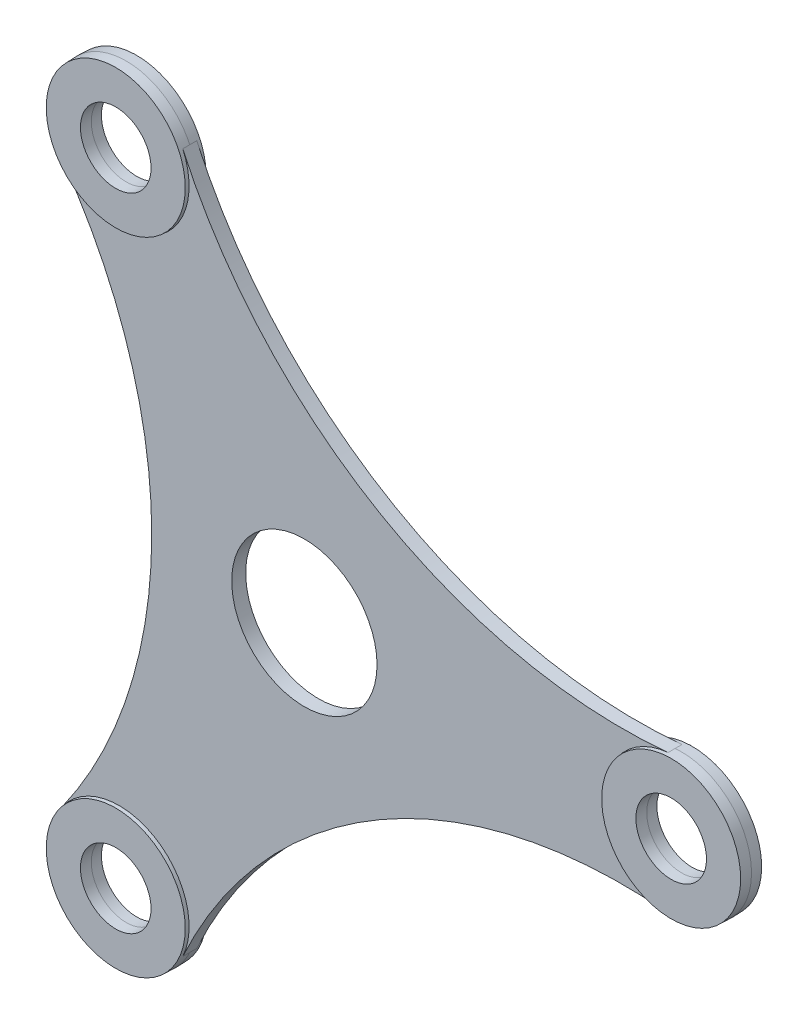
ISO-10303-21;
HEADER;
FILE_DESCRIPTION(('STEP AP214'),'2;1');
FILE_NAME('part.step','',(''),(''),'','','');
FILE_SCHEMA(('AUTOMOTIVE_DESIGN { 1 0 10303 214 1 1 1 1 }'));
ENDSEC;
DATA;
#1=APPLICATION_CONTEXT('core data for automotive mechanical design processes');
#2=APPLICATION_PROTOCOL_DEFINITION('international standard','automotive_design',2000,#1);
#3=PRODUCT_CONTEXT('',#1,'mechanical');
#4=PRODUCT('Part','Part','',(#3));
#5=PRODUCT_RELATED_PRODUCT_CATEGORY('part','',(#4));
#6=PRODUCT_DEFINITION_FORMATION('','',#4);
#7=PRODUCT_DEFINITION_CONTEXT('part definition',#1,'design');
#8=PRODUCT_DEFINITION('design','',#6,#7);
#9=PRODUCT_DEFINITION_SHAPE('','',#8);
#10=(LENGTH_UNIT() NAMED_UNIT(*) SI_UNIT(.MILLI.,.METRE.));
#11=(NAMED_UNIT(*) PLANE_ANGLE_UNIT() SI_UNIT($,.RADIAN.));
#12=(NAMED_UNIT(*) SI_UNIT($,.STERADIAN.) SOLID_ANGLE_UNIT());
#13=UNCERTAINTY_MEASURE_WITH_UNIT(LENGTH_MEASURE(1.E-05),#10,'distance_accuracy_value','');
#14=(GEOMETRIC_REPRESENTATION_CONTEXT(3) GLOBAL_UNCERTAINTY_ASSIGNED_CONTEXT((#13)) GLOBAL_UNIT_ASSIGNED_CONTEXT((#10,
#11,#12)) REPRESENTATION_CONTEXT('',''));
#15=CARTESIAN_POINT('',(0.,0.,0.));
#16=DIRECTION('',(0.,0.,1.));
#17=DIRECTION('',(1.,0.,0.));
#18=AXIS2_PLACEMENT_3D('',#15,#16,#17);
#19=CARTESIAN_POINT('',(264.973105174423,0.,0.));
#20=DIRECTION('',(0.,0.,-1.));
#21=DIRECTION('',(1.,0.,0.));
#22=AXIS2_PLACEMENT_3D('',#19,#20,#21);
#23=CONICAL_SURFACE('',#22,25.,0.0349065850398867);
#24=CARTESIAN_POINT('',(264.973105174423,0.,-7.5));
#25=DIRECTION('',(0.,0.,1.));
#26=DIRECTION('',(1.,0.,0.));
#27=AXIS2_PLACEMENT_3D('',#24,#25,#26);
#28=CIRCLE('',#27,25.2619057711881);
#29=CARTESIAN_POINT('',(290.235010945611,0.,-7.5));
#30=VERTEX_POINT('',#29);
#31=EDGE_CURVE('E61',#30,#30,#28,.T.);
#32=ORIENTED_EDGE('',*,*,#31,.F.);
#33=EDGE_LOOP('',(#32));
#34=FACE_BOUND('',#33,.T.);
#35=CARTESIAN_POINT('',(264.973105174423,0.,0.));
#36=DIRECTION('',(0.,0.,1.));
#37=DIRECTION('',(1.,0.,0.));
#38=AXIS2_PLACEMENT_3D('',#35,#36,#37);
#39=CIRCLE('',#38,25.);
#40=CARTESIAN_POINT('',(289.973105174423,0.,0.));
#41=VERTEX_POINT('',#40);
#42=EDGE_CURVE('E77',#41,#41,#39,.T.);
#43=ORIENTED_EDGE('',*,*,#42,.T.);
#44=EDGE_LOOP('',(#43));
#45=FACE_BOUND('',#44,.T.);
#46=ADVANCED_FACE('F54',(#34,#45),#23,.F.);
#47=CARTESIAN_POINT('',(264.973105174423,0.,0.));
#48=DIRECTION('',(0.,0.,1.));
#49=DIRECTION('',(1.,0.,0.));
#50=AXIS2_PLACEMENT_3D('',#47,#48,#49);
#51=CONICAL_SURFACE('',#50,50.0000000000001,0.0349065850398867);
#52=CARTESIAN_POINT('',(264.973105174423,0.,-7.5));
#53=DIRECTION('',(0.,0.,1.));
#54=DIRECTION('',(1.,0.,0.));
#55=AXIS2_PLACEMENT_3D('',#52,#53,#54);
#56=CIRCLE('',#55,49.738094228812);
#57=CARTESIAN_POINT('',(314.711199403235,0.,-7.5));
#58=VERTEX_POINT('',#57);
#59=EDGE_CURVE('E11',#58,#58,#56,.T.);
#60=ORIENTED_EDGE('',*,*,#59,.T.);
#61=EDGE_LOOP('',(#60));
#62=FACE_BOUND('',#61,.T.);
#63=CARTESIAN_POINT('',(264.973105174423,0.,0.));
#64=DIRECTION('',(0.,0.,1.));
#65=DIRECTION('',(1.,0.,0.));
#66=AXIS2_PLACEMENT_3D('',#63,#64,#65);
#67=CIRCLE('',#66,50.0000000000001);
#68=CARTESIAN_POINT('',(314.973105174423,0.,0.));
#69=VERTEX_POINT('',#68);
#70=EDGE_CURVE('E65',#69,#69,#67,.T.);
#71=ORIENTED_EDGE('',*,*,#70,.F.);
#72=EDGE_LOOP('',(#71));
#73=FACE_BOUND('',#72,.T.);
#74=ADVANCED_FACE('F56',(#62,#73),#51,.T.);
#75=CARTESIAN_POINT('',(0.,0.,-7.5));
#76=DIRECTION('',(0.,0.,1.));
#77=DIRECTION('',(1.,0.,0.));
#78=AXIS2_PLACEMENT_3D('',#75,#76,#77);
#79=PLANE('',#78);
#80=ORIENTED_EDGE('',*,*,#31,.T.);
#81=EDGE_LOOP('',(#80));
#82=FACE_BOUND('',#81,.T.);
#83=ORIENTED_EDGE('',*,*,#59,.F.);
#84=EDGE_LOOP('',(#83));
#85=FACE_BOUND('',#84,.T.);
#86=ADVANCED_FACE('F85',(#82,#85),#79,.F.);
#87=CARTESIAN_POINT('',(264.973105174423,0.,0.));
#88=DIRECTION('',(0.,0.,1.));
#89=DIRECTION('',(1.,0.,0.));
#90=AXIS2_PLACEMENT_3D('',#87,#88,#89);
#91=CONICAL_SURFACE('',#90,25.,0.0349065850398867);
#92=CARTESIAN_POINT('',(264.973105174423,0.,7.5));
#93=DIRECTION('',(0.,0.,1.));
#94=DIRECTION('',(1.,0.,0.));
#95=AXIS2_PLACEMENT_3D('',#92,#93,#94);
#96=CIRCLE('',#95,25.2619057711881);
#97=CARTESIAN_POINT('',(290.235010945611,0.,7.5));
#98=VERTEX_POINT('',#97);
#99=EDGE_CURVE('E74',#98,#98,#96,.T.);
#100=ORIENTED_EDGE('',*,*,#99,.T.);
#101=EDGE_LOOP('',(#100));
#102=FACE_BOUND('',#101,.T.);
#103=ORIENTED_EDGE('',*,*,#42,.F.);
#104=EDGE_LOOP('',(#103));
#105=FACE_BOUND('',#104,.T.);
#106=ADVANCED_FACE('F82',(#102,#105),#91,.F.);
#107=CARTESIAN_POINT('',(264.973105174423,0.,0.));
#108=DIRECTION('',(0.,0.,-1.));
#109=DIRECTION('',(1.,0.,0.));
#110=AXIS2_PLACEMENT_3D('',#107,#108,#109);
#111=CONICAL_SURFACE('',#110,50.0000000000001,0.0349065850398867);
#112=CARTESIAN_POINT('',(264.973105174423,0.,7.5));
#113=DIRECTION('',(0.,0.,1.));
#114=DIRECTION('',(1.,0.,0.));
#115=AXIS2_PLACEMENT_3D('',#112,#113,#114);
#116=CIRCLE('',#115,49.738094228812);
#117=CARTESIAN_POINT('',(314.711199403235,0.,7.5));
#118=VERTEX_POINT('',#117);
#119=EDGE_CURVE('E69',#118,#118,#116,.T.);
#120=ORIENTED_EDGE('',*,*,#119,.F.);
#121=EDGE_LOOP('',(#120));
#122=FACE_BOUND('',#121,.T.);
#123=ORIENTED_EDGE('',*,*,#70,.T.);
#124=EDGE_LOOP('',(#123));
#125=FACE_BOUND('',#124,.T.);
#126=ADVANCED_FACE('F84',(#122,#125),#111,.T.);
#127=CARTESIAN_POINT('',(0.,0.,7.5));
#128=DIRECTION('',(0.,0.,1.));
#129=DIRECTION('',(1.,0.,0.));
#130=AXIS2_PLACEMENT_3D('',#127,#128,#129);
#131=PLANE('',#130);
#132=ORIENTED_EDGE('',*,*,#99,.F.);
#133=EDGE_LOOP('',(#132));
#134=FACE_BOUND('',#133,.T.);
#135=ORIENTED_EDGE('',*,*,#119,.T.);
#136=EDGE_LOOP('',(#135));
#137=FACE_BOUND('',#136,.T.);
#138=ADVANCED_FACE('F92',(#134,#137),#131,.T.);
#139=CLOSED_SHELL('',(#46,#74,#86,#106,#126,#138));
#140=MANIFOLD_SOLID_BREP('B2',#139);
#141=CARTESIAN_POINT('',(-132.486552587212,-229.473440400696,0.));
#142=DIRECTION('',(0.,0.,-1.));
#143=DIRECTION('',(1.,0.,0.));
#144=AXIS2_PLACEMENT_3D('',#141,#142,#143);
#145=CONICAL_SURFACE('',#144,25.,0.0349065850398867);
#146=CARTESIAN_POINT('',(-132.486552587212,-229.473440400696,-7.5));
#147=DIRECTION('',(0.,0.,1.));
#148=DIRECTION('',(1.,0.,0.));
#149=AXIS2_PLACEMENT_3D('',#146,#147,#148);
#150=CIRCLE('',#149,25.2619057711881);
#151=CARTESIAN_POINT('',(-107.224646816023,-229.473440400696,-7.5));
#152=VERTEX_POINT('',#151);
#153=EDGE_CURVE('E161',#152,#152,#150,.T.);
#154=ORIENTED_EDGE('',*,*,#153,.F.);
#155=EDGE_LOOP('',(#154));
#156=FACE_BOUND('',#155,.T.);
#157=CARTESIAN_POINT('',(-132.486552587212,-229.473440400696,0.));
#158=DIRECTION('',(0.,0.,1.));
#159=DIRECTION('',(1.,0.,0.));
#160=AXIS2_PLACEMENT_3D('',#157,#158,#159);
#161=CIRCLE('',#160,25.);
#162=CARTESIAN_POINT('',(-107.486552587212,-229.473440400696,0.));
#163=VERTEX_POINT('',#162);
#164=EDGE_CURVE('E177',#163,#163,#161,.T.);
#165=ORIENTED_EDGE('',*,*,#164,.T.);
#166=EDGE_LOOP('',(#165));
#167=FACE_BOUND('',#166,.T.);
#168=ADVANCED_FACE('F154',(#156,#167),#145,.F.);
#169=CARTESIAN_POINT('',(-132.486552587212,-229.473440400696,0.));
#170=DIRECTION('',(0.,0.,1.));
#171=DIRECTION('',(1.,0.,0.));
#172=AXIS2_PLACEMENT_3D('',#169,#170,#171);
#173=CONICAL_SURFACE('',#172,50.,0.0349065850398867);
#174=CARTESIAN_POINT('',(-132.486552587212,-229.473440400696,-7.5));
#175=DIRECTION('',(0.,0.,1.));
#176=DIRECTION('',(1.,0.,0.));
#177=AXIS2_PLACEMENT_3D('',#174,#175,#176);
#178=CIRCLE('',#177,49.7380942288119);
#179=CARTESIAN_POINT('',(-82.7484583583997,-229.473440400696,-7.5));
#180=VERTEX_POINT('',#179);
#181=EDGE_CURVE('E53',#180,#180,#178,.T.);
#182=ORIENTED_EDGE('',*,*,#181,.T.);
#183=EDGE_LOOP('',(#182));
#184=FACE_BOUND('',#183,.T.);
#185=CARTESIAN_POINT('',(-132.486552587212,-229.473440400696,0.));
#186=DIRECTION('',(0.,0.,1.));
#187=DIRECTION('',(1.,0.,0.));
#188=AXIS2_PLACEMENT_3D('',#185,#186,#187);
#189=CIRCLE('',#188,50.);
#190=CARTESIAN_POINT('',(-82.4865525872115,-229.473440400696,0.));
#191=VERTEX_POINT('',#190);
#192=EDGE_CURVE('E165',#191,#191,#189,.T.);
#193=ORIENTED_EDGE('',*,*,#192,.F.);
#194=EDGE_LOOP('',(#193));
#195=FACE_BOUND('',#194,.T.);
#196=ADVANCED_FACE('F156',(#184,#195),#173,.T.);
#197=CARTESIAN_POINT('',(0.,0.,-7.5));
#198=DIRECTION('',(0.,0.,1.));
#199=DIRECTION('',(1.,0.,0.));
#200=AXIS2_PLACEMENT_3D('',#197,#198,#199);
#201=PLANE('',#200);
#202=ORIENTED_EDGE('',*,*,#153,.T.);
#203=EDGE_LOOP('',(#202));
#204=FACE_BOUND('',#203,.T.);
#205=ORIENTED_EDGE('',*,*,#181,.F.);
#206=EDGE_LOOP('',(#205));
#207=FACE_BOUND('',#206,.T.);
#208=ADVANCED_FACE('F185',(#204,#207),#201,.F.);
#209=CARTESIAN_POINT('',(-132.486552587212,-229.473440400696,0.));
#210=DIRECTION('',(0.,0.,1.));
#211=DIRECTION('',(1.,0.,0.));
#212=AXIS2_PLACEMENT_3D('',#209,#210,#211);
#213=CONICAL_SURFACE('',#212,25.,0.0349065850398867);
#214=CARTESIAN_POINT('',(-132.486552587212,-229.473440400696,7.5));
#215=DIRECTION('',(0.,0.,1.));
#216=DIRECTION('',(1.,0.,0.));
#217=AXIS2_PLACEMENT_3D('',#214,#215,#216);
#218=CIRCLE('',#217,25.2619057711881);
#219=CARTESIAN_POINT('',(-107.224646816023,-229.473440400696,7.5));
#220=VERTEX_POINT('',#219);
#221=EDGE_CURVE('E174',#220,#220,#218,.T.);
#222=ORIENTED_EDGE('',*,*,#221,.T.);
#223=EDGE_LOOP('',(#222));
#224=FACE_BOUND('',#223,.T.);
#225=ORIENTED_EDGE('',*,*,#164,.F.);
#226=EDGE_LOOP('',(#225));
#227=FACE_BOUND('',#226,.T.);
#228=ADVANCED_FACE('F182',(#224,#227),#213,.F.);
#229=CARTESIAN_POINT('',(-132.486552587212,-229.473440400696,0.));
#230=DIRECTION('',(0.,0.,-1.));
#231=DIRECTION('',(1.,0.,0.));
#232=AXIS2_PLACEMENT_3D('',#229,#230,#231);
#233=CONICAL_SURFACE('',#232,50.,0.0349065850398867);
#234=CARTESIAN_POINT('',(-132.486552587212,-229.473440400696,7.5));
#235=DIRECTION('',(0.,0.,1.));
#236=DIRECTION('',(1.,0.,0.));
#237=AXIS2_PLACEMENT_3D('',#234,#235,#236);
#238=CIRCLE('',#237,49.7380942288119);
#239=CARTESIAN_POINT('',(-82.7484583583997,-229.473440400696,7.5));
#240=VERTEX_POINT('',#239);
#241=EDGE_CURVE('E169',#240,#240,#238,.T.);
#242=ORIENTED_EDGE('',*,*,#241,.F.);
#243=EDGE_LOOP('',(#242));
#244=FACE_BOUND('',#243,.T.);
#245=ORIENTED_EDGE('',*,*,#192,.T.);
#246=EDGE_LOOP('',(#245));
#247=FACE_BOUND('',#246,.T.);
#248=ADVANCED_FACE('F184',(#244,#247),#233,.T.);
#249=CARTESIAN_POINT('',(0.,0.,7.5));
#250=DIRECTION('',(0.,0.,1.));
#251=DIRECTION('',(1.,0.,0.));
#252=AXIS2_PLACEMENT_3D('',#249,#250,#251);
#253=PLANE('',#252);
#254=ORIENTED_EDGE('',*,*,#221,.F.);
#255=EDGE_LOOP('',(#254));
#256=FACE_BOUND('',#255,.T.);
#257=ORIENTED_EDGE('',*,*,#241,.T.);
#258=EDGE_LOOP('',(#257));
#259=FACE_BOUND('',#258,.T.);
#260=ADVANCED_FACE('F192',(#256,#259),#253,.T.);
#261=CLOSED_SHELL('',(#168,#196,#208,#228,#248,#260));
#262=MANIFOLD_SOLID_BREP('B6',#261);
#263=CARTESIAN_POINT('',(-132.486552587211,229.473440400696,0.));
#264=DIRECTION('',(0.,0.,-1.));
#265=DIRECTION('',(1.,0.,0.));
#266=AXIS2_PLACEMENT_3D('',#263,#264,#265);
#267=CONICAL_SURFACE('',#266,25.,0.0349065850398867);
#268=CARTESIAN_POINT('',(-132.486552587211,229.473440400696,-7.5));
#269=DIRECTION('',(0.,0.,1.));
#270=DIRECTION('',(1.,0.,0.));
#271=AXIS2_PLACEMENT_3D('',#268,#269,#270);
#272=CIRCLE('',#271,25.2619057711881);
#273=CARTESIAN_POINT('',(-107.224646816023,229.473440400696,-7.5));
#274=VERTEX_POINT('',#273);
#275=EDGE_CURVE('E262',#274,#274,#272,.T.);
#276=ORIENTED_EDGE('',*,*,#275,.F.);
#277=EDGE_LOOP('',(#276));
#278=FACE_BOUND('',#277,.T.);
#279=CARTESIAN_POINT('',(-132.486552587211,229.473440400696,0.));
#280=DIRECTION('',(0.,0.,1.));
#281=DIRECTION('',(1.,0.,0.));
#282=AXIS2_PLACEMENT_3D('',#279,#280,#281);
#283=CIRCLE('',#282,25.);
#284=CARTESIAN_POINT('',(-107.486552587211,229.473440400696,0.));
#285=VERTEX_POINT('',#284);
#286=EDGE_CURVE('E278',#285,#285,#283,.T.);
#287=ORIENTED_EDGE('',*,*,#286,.T.);
#288=EDGE_LOOP('',(#287));
#289=FACE_BOUND('',#288,.T.);
#290=ADVANCED_FACE('F255',(#278,#289),#267,.F.);
#291=CARTESIAN_POINT('',(-132.486552587211,229.473440400696,0.));
#292=DIRECTION('',(0.,0.,1.));
#293=DIRECTION('',(1.,0.,0.));
#294=AXIS2_PLACEMENT_3D('',#291,#292,#293);
#295=CONICAL_SURFACE('',#294,50.,0.0349065850398867);
#296=CARTESIAN_POINT('',(-132.486552587211,229.473440400696,-7.5));
#297=DIRECTION('',(0.,0.,1.));
#298=DIRECTION('',(1.,0.,0.));
#299=AXIS2_PLACEMENT_3D('',#296,#297,#298);
#300=CIRCLE('',#299,49.7380942288119);
#301=CARTESIAN_POINT('',(-82.7484583583994,229.473440400696,-7.5));
#302=VERTEX_POINT('',#301);
#303=EDGE_CURVE('E153',#302,#302,#300,.T.);
#304=ORIENTED_EDGE('',*,*,#303,.T.);
#305=EDGE_LOOP('',(#304));
#306=FACE_BOUND('',#305,.T.);
#307=CARTESIAN_POINT('',(-132.486552587211,229.473440400696,0.));
#308=DIRECTION('',(0.,0.,1.));
#309=DIRECTION('',(1.,0.,0.));
#310=AXIS2_PLACEMENT_3D('',#307,#308,#309);
#311=CIRCLE('',#310,50.);
#312=CARTESIAN_POINT('',(-82.4865525872113,229.473440400696,0.));
#313=VERTEX_POINT('',#312);
#314=EDGE_CURVE('E266',#313,#313,#311,.T.);
#315=ORIENTED_EDGE('',*,*,#314,.F.);
#316=EDGE_LOOP('',(#315));
#317=FACE_BOUND('',#316,.T.);
#318=ADVANCED_FACE('F257',(#306,#317),#295,.T.);
#319=CARTESIAN_POINT('',(0.,0.,-7.5));
#320=DIRECTION('',(0.,0.,1.));
#321=DIRECTION('',(1.,0.,0.));
#322=AXIS2_PLACEMENT_3D('',#319,#320,#321);
#323=PLANE('',#322);
#324=ORIENTED_EDGE('',*,*,#275,.T.);
#325=EDGE_LOOP('',(#324));
#326=FACE_BOUND('',#325,.T.);
#327=ORIENTED_EDGE('',*,*,#303,.F.);
#328=EDGE_LOOP('',(#327));
#329=FACE_BOUND('',#328,.T.);
#330=ADVANCED_FACE('F286',(#326,#329),#323,.F.);
#331=CARTESIAN_POINT('',(-132.486552587211,229.473440400696,0.));
#332=DIRECTION('',(0.,0.,1.));
#333=DIRECTION('',(1.,0.,0.));
#334=AXIS2_PLACEMENT_3D('',#331,#332,#333);
#335=CONICAL_SURFACE('',#334,25.,0.0349065850398867);
#336=CARTESIAN_POINT('',(-132.486552587211,229.473440400696,7.5));
#337=DIRECTION('',(0.,0.,1.));
#338=DIRECTION('',(1.,0.,0.));
#339=AXIS2_PLACEMENT_3D('',#336,#337,#338);
#340=CIRCLE('',#339,25.2619057711881);
#341=CARTESIAN_POINT('',(-107.224646816023,229.473440400696,7.5));
#342=VERTEX_POINT('',#341);
#343=EDGE_CURVE('E275',#342,#342,#340,.T.);
#344=ORIENTED_EDGE('',*,*,#343,.T.);
#345=EDGE_LOOP('',(#344));
#346=FACE_BOUND('',#345,.T.);
#347=ORIENTED_EDGE('',*,*,#286,.F.);
#348=EDGE_LOOP('',(#347));
#349=FACE_BOUND('',#348,.T.);
#350=ADVANCED_FACE('F283',(#346,#349),#335,.F.);
#351=CARTESIAN_POINT('',(-132.486552587211,229.473440400696,0.));
#352=DIRECTION('',(0.,0.,-1.));
#353=DIRECTION('',(1.,0.,0.));
#354=AXIS2_PLACEMENT_3D('',#351,#352,#353);
#355=CONICAL_SURFACE('',#354,50.,0.0349065850398867);
#356=CARTESIAN_POINT('',(-132.486552587211,229.473440400696,7.5));
#357=DIRECTION('',(0.,0.,1.));
#358=DIRECTION('',(1.,0.,0.));
#359=AXIS2_PLACEMENT_3D('',#356,#357,#358);
#360=CIRCLE('',#359,49.7380942288119);
#361=CARTESIAN_POINT('',(-82.7484583583994,229.473440400696,7.5));
#362=VERTEX_POINT('',#361);
#363=EDGE_CURVE('E270',#362,#362,#360,.T.);
#364=ORIENTED_EDGE('',*,*,#363,.F.);
#365=EDGE_LOOP('',(#364));
#366=FACE_BOUND('',#365,.T.);
#367=ORIENTED_EDGE('',*,*,#314,.T.);
#368=EDGE_LOOP('',(#367));
#369=FACE_BOUND('',#368,.T.);
#370=ADVANCED_FACE('F285',(#366,#369),#355,.T.);
#371=CARTESIAN_POINT('',(0.,0.,7.5));
#372=DIRECTION('',(0.,0.,1.));
#373=DIRECTION('',(1.,0.,0.));
#374=AXIS2_PLACEMENT_3D('',#371,#372,#373);
#375=PLANE('',#374);
#376=ORIENTED_EDGE('',*,*,#343,.F.);
#377=EDGE_LOOP('',(#376));
#378=FACE_BOUND('',#377,.T.);
#379=ORIENTED_EDGE('',*,*,#363,.T.);
#380=EDGE_LOOP('',(#379));
#381=FACE_BOUND('',#380,.T.);
#382=ADVANCED_FACE('F293',(#378,#381),#375,.T.);
#383=CLOSED_SHELL('',(#290,#318,#330,#350,#370,#382));
#384=MANIFOLD_SOLID_BREP('B48',#383);
#385=CARTESIAN_POINT('',(-132.486552587211,229.473440400696,5.));
#386=DIRECTION('',(0.,0.,-1.));
#387=DIRECTION('',(-1.,0.,0.));
#388=AXIS2_PLACEMENT_3D('',#385,#386,#387);
#389=CYLINDRICAL_SURFACE('',#388,50.);
#390=CARTESIAN_POINT('',(-132.486552587211,229.473440400696,-5.));
#391=DIRECTION('',(0.,0.,1.));
#392=DIRECTION('',(1.,0.,0.));
#393=AXIS2_PLACEMENT_3D('',#390,#391,#392);
#394=CIRCLE('',#393,50.);
#395=CARTESIAN_POINT('',(-173.235932996346,200.499521158184,-5.));
#396=VERTEX_POINT('',#395);
#397=CARTESIAN_POINT('',(-87.0197122714296,250.276479402227,-5.));
#398=VERTEX_POINT('',#397);
#399=EDGE_CURVE('E438',#396,#398,#394,.T.);
#400=ORIENTED_EDGE('',*,*,#399,.F.);
#401=DIRECTION('',(0.,0.,-1.));
#402=VECTOR('',#401,1.);
#403=CARTESIAN_POINT('',(-173.235932996346,200.499521158184,5.));
#404=LINE('',#403,#402);
#405=CARTESIAN_POINT('',(-173.235932996346,200.499521158184,5.));
#406=VERTEX_POINT('',#405);
#407=EDGE_CURVE('E253',#406,#396,#404,.T.);
#408=ORIENTED_EDGE('',*,*,#407,.F.);
#409=CARTESIAN_POINT('',(-132.486552587211,229.473440400696,5.));
#410=DIRECTION('',(0.,0.,1.));
#411=DIRECTION('',(1.,0.,0.));
#412=AXIS2_PLACEMENT_3D('',#409,#410,#411);
#413=CIRCLE('',#412,50.);
#414=CARTESIAN_POINT('',(-87.0197122714296,250.276479402227,5.));
#415=VERTEX_POINT('',#414);
#416=EDGE_CURVE('E541',#406,#415,#413,.T.);
#417=ORIENTED_EDGE('',*,*,#416,.T.);
#418=DIRECTION('',(0.,0.,-1.));
#419=VECTOR('',#418,1.);
#420=CARTESIAN_POINT('',(-87.0197122714296,250.276479402227,5.));
#421=LINE('',#420,#419);
#422=EDGE_CURVE('E365',#415,#398,#421,.T.);
#423=ORIENTED_EDGE('',*,*,#422,.T.);
#424=EDGE_LOOP('',(#400,#408,#417,#423));
#425=FACE_BOUND('',#424,.T.);
#426=ADVANCED_FACE('F347',(#425),#389,.F.);
#427=CARTESIAN_POINT('',(-455.22164542756,3.09546496508189E-13,5.));
#428=DIRECTION('',(0.,0.,-1.));
#429=DIRECTION('',(-1.,0.,0.));
#430=AXIS2_PLACEMENT_3D('',#427,#428,#429);
#431=CYLINDRICAL_SURFACE('',#430,346.);
#432=CARTESIAN_POINT('',(-455.22164542756,3.09546496508189E-13,-5.));
#433=DIRECTION('',(0.,0.,1.));
#434=DIRECTION('',(1.,0.,0.));
#435=AXIS2_PLACEMENT_3D('',#432,#433,#434);
#436=CIRCLE('',#435,346.);
#437=CARTESIAN_POINT('',(-173.235932996346,-200.499521158184,-5.));
#438=VERTEX_POINT('',#437);
#439=EDGE_CURVE('E441',#396,#438,#436,.F.);
#440=ORIENTED_EDGE('',*,*,#439,.T.);
#441=DIRECTION('',(0.,0.,-1.));
#442=VECTOR('',#441,1.);
#443=CARTESIAN_POINT('',(-173.235932996346,-200.499521158184,5.));
#444=LINE('',#443,#442);
#445=CARTESIAN_POINT('',(-173.235932996346,-200.499521158184,5.));
#446=VERTEX_POINT('',#445);
#447=EDGE_CURVE('E357',#446,#438,#444,.T.);
#448=ORIENTED_EDGE('',*,*,#447,.F.);
#449=CARTESIAN_POINT('',(-455.22164542756,3.09546496508189E-13,5.));
#450=DIRECTION('',(0.,0.,1.));
#451=DIRECTION('',(1.,0.,0.));
#452=AXIS2_PLACEMENT_3D('',#449,#450,#451);
#453=CIRCLE('',#452,346.);
#454=EDGE_CURVE('E544',#406,#446,#453,.F.);
#455=ORIENTED_EDGE('',*,*,#454,.F.);
#456=ORIENTED_EDGE('',*,*,#407,.T.);
#457=EDGE_LOOP('',(#440,#448,#455,#456));
#458=FACE_BOUND('',#457,.T.);
#459=ADVANCED_FACE('F471',(#458),#431,.F.);
#460=CARTESIAN_POINT('',(-132.486552587212,-229.473440400696,5.));
#461=DIRECTION('',(0.,0.,-1.));
#462=DIRECTION('',(-1.,0.,0.));
#463=AXIS2_PLACEMENT_3D('',#460,#461,#462);
#464=CYLINDRICAL_SURFACE('',#463,50.);
#465=CARTESIAN_POINT('',(-132.486552587212,-229.473440400696,-5.));
#466=DIRECTION('',(0.,0.,1.));
#467=DIRECTION('',(1.,0.,0.));
#468=AXIS2_PLACEMENT_3D('',#465,#466,#467);
#469=CIRCLE('',#468,50.);
#470=CARTESIAN_POINT('',(-87.0197122714299,-250.276479402227,-5.));
#471=VERTEX_POINT('',#470);
#472=EDGE_CURVE('E445',#471,#438,#469,.T.);
#473=ORIENTED_EDGE('',*,*,#472,.F.);
#474=DIRECTION('',(0.,0.,-1.));
#475=VECTOR('',#474,1.);
#476=CARTESIAN_POINT('',(-87.0197122714299,-250.276479402227,5.));
#477=LINE('',#476,#475);
#478=CARTESIAN_POINT('',(-87.0197122714299,-250.276479402227,5.));
#479=VERTEX_POINT('',#478);
#480=EDGE_CURVE('E424',#479,#471,#477,.T.);
#481=ORIENTED_EDGE('',*,*,#480,.F.);
#482=CARTESIAN_POINT('',(-132.486552587212,-229.473440400696,5.));
#483=DIRECTION('',(0.,0.,1.));
#484=DIRECTION('',(1.,0.,0.));
#485=AXIS2_PLACEMENT_3D('',#482,#483,#484);
#486=CIRCLE('',#485,50.);
#487=EDGE_CURVE('E412',#479,#446,#486,.T.);
#488=ORIENTED_EDGE('',*,*,#487,.T.);
#489=ORIENTED_EDGE('',*,*,#447,.T.);
#490=EDGE_LOOP('',(#473,#481,#488,#489));
#491=FACE_BOUND('',#490,.T.);
#492=ADVANCED_FACE('F468',(#491),#464,.F.);
#493=CARTESIAN_POINT('',(227.610822713779,-394.23350929282,5.));
#494=DIRECTION('',(0.,0.,-1.));
#495=DIRECTION('',(-1.,0.,0.));
#496=AXIS2_PLACEMENT_3D('',#493,#494,#495);
#497=CYLINDRICAL_SURFACE('',#496,346.);
#498=CARTESIAN_POINT('',(227.610822713779,-394.23350929282,-5.));
#499=DIRECTION('',(0.,0.,1.));
#500=DIRECTION('',(1.,0.,0.));
#501=AXIS2_PLACEMENT_3D('',#498,#499,#500);
#502=CIRCLE('',#501,346.);
#503=CARTESIAN_POINT('',(260.255645267776,-49.776958244043,-5.));
#504=VERTEX_POINT('',#503);
#505=EDGE_CURVE('E420',#471,#504,#502,.F.);
#506=ORIENTED_EDGE('',*,*,#505,.T.);
#507=DIRECTION('',(0.,0.,-1.));
#508=VECTOR('',#507,1.);
#509=CARTESIAN_POINT('',(260.255645267776,-49.776958244043,5.));
#510=LINE('',#509,#508);
#511=CARTESIAN_POINT('',(260.255645267776,-49.776958244043,5.));
#512=VERTEX_POINT('',#511);
#513=EDGE_CURVE('E417',#512,#504,#510,.T.);
#514=ORIENTED_EDGE('',*,*,#513,.F.);
#515=CARTESIAN_POINT('',(227.610822713779,-394.23350929282,5.));
#516=DIRECTION('',(0.,0.,1.));
#517=DIRECTION('',(1.,0.,0.));
#518=AXIS2_PLACEMENT_3D('',#515,#516,#517);
#519=CIRCLE('',#518,346.);
#520=EDGE_CURVE('E404',#479,#512,#519,.F.);
#521=ORIENTED_EDGE('',*,*,#520,.F.);
#522=ORIENTED_EDGE('',*,*,#480,.T.);
#523=EDGE_LOOP('',(#506,#514,#521,#522));
#524=FACE_BOUND('',#523,.T.);
#525=ADVANCED_FACE('F418',(#524),#497,.F.);
#526=CARTESIAN_POINT('',(264.973105174423,0.,5.));
#527=DIRECTION('',(0.,0.,-1.));
#528=DIRECTION('',(-1.,0.,0.));
#529=AXIS2_PLACEMENT_3D('',#526,#527,#528);
#530=CYLINDRICAL_SURFACE('',#529,50.0000000000001);
#531=CARTESIAN_POINT('',(264.973105174423,0.,-5.));
#532=DIRECTION('',(0.,0.,1.));
#533=DIRECTION('',(1.,0.,0.));
#534=AXIS2_PLACEMENT_3D('',#531,#532,#533);
#535=CIRCLE('',#534,50.0000000000001);
#536=CARTESIAN_POINT('',(260.255645267776,49.7769582440428,-5.));
#537=VERTEX_POINT('',#536);
#538=EDGE_CURVE('E451',#537,#504,#535,.T.);
#539=ORIENTED_EDGE('',*,*,#538,.F.);
#540=DIRECTION('',(0.,0.,-1.));
#541=VECTOR('',#540,1.);
#542=CARTESIAN_POINT('',(260.255645267776,49.7769582440428,5.));
#543=LINE('',#542,#541);
#544=CARTESIAN_POINT('',(260.255645267776,49.7769582440428,5.));
#545=VERTEX_POINT('',#544);
#546=EDGE_CURVE('E384',#545,#537,#543,.T.);
#547=ORIENTED_EDGE('',*,*,#546,.F.);
#548=CARTESIAN_POINT('',(264.973105174423,0.,5.));
#549=DIRECTION('',(0.,0.,1.));
#550=DIRECTION('',(1.,0.,0.));
#551=AXIS2_PLACEMENT_3D('',#548,#549,#550);
#552=CIRCLE('',#551,50.0000000000001);
#553=EDGE_CURVE('E410',#545,#512,#552,.T.);
#554=ORIENTED_EDGE('',*,*,#553,.T.);
#555=ORIENTED_EDGE('',*,*,#513,.T.);
#556=EDGE_LOOP('',(#539,#547,#554,#555));
#557=FACE_BOUND('',#556,.T.);
#558=ADVANCED_FACE('F426',(#557),#530,.F.);
#559=CARTESIAN_POINT('',(0.,0.,5.));
#560=DIRECTION('',(0.,0.,-1.));
#561=DIRECTION('',(-1.,0.,0.));
#562=AXIS2_PLACEMENT_3D('',#559,#560,#561);
#563=CYLINDRICAL_SURFACE('',#562,52.);
#564=CARTESIAN_POINT('',(0.,0.,5.));
#565=DIRECTION('',(0.,0.,1.));
#566=DIRECTION('',(1.,0.,0.));
#567=AXIS2_PLACEMENT_3D('',#564,#565,#566);
#568=CIRCLE('',#567,52.);
#569=CARTESIAN_POINT('',(52.,0.,5.));
#570=VERTEX_POINT('',#569);
#571=EDGE_CURVE('E458',#570,#570,#568,.T.);
#572=ORIENTED_EDGE('',*,*,#571,.T.);
#573=EDGE_LOOP('',(#572));
#574=FACE_BOUND('',#573,.T.);
#575=CARTESIAN_POINT('',(0.,0.,-5.));
#576=DIRECTION('',(0.,0.,1.));
#577=DIRECTION('',(1.,0.,0.));
#578=AXIS2_PLACEMENT_3D('',#575,#576,#577);
#579=CIRCLE('',#578,52.);
#580=CARTESIAN_POINT('',(52.,0.,-5.));
#581=VERTEX_POINT('',#580);
#582=EDGE_CURVE('E434',#581,#581,#579,.T.);
#583=ORIENTED_EDGE('',*,*,#582,.F.);
#584=EDGE_LOOP('',(#583));
#585=FACE_BOUND('',#584,.T.);
#586=ADVANCED_FACE('F349',(#574,#585),#563,.F.);
#587=CARTESIAN_POINT('',(227.61082271378,394.233509292819,5.));
#588=DIRECTION('',(0.,0.,-1.));
#589=DIRECTION('',(-1.,0.,0.));
#590=AXIS2_PLACEMENT_3D('',#587,#588,#589);
#591=CYLINDRICAL_SURFACE('',#590,346.);
#592=CARTESIAN_POINT('',(227.61082271378,394.233509292819,-5.));
#593=DIRECTION('',(0.,0.,1.));
#594=DIRECTION('',(1.,0.,0.));
#595=AXIS2_PLACEMENT_3D('',#592,#593,#594);
#596=CIRCLE('',#595,346.);
#597=EDGE_CURVE('E454',#398,#537,#596,.T.);
#598=ORIENTED_EDGE('',*,*,#597,.F.);
#599=ORIENTED_EDGE('',*,*,#422,.F.);
#600=CARTESIAN_POINT('',(227.61082271378,394.233509292819,5.));
#601=DIRECTION('',(0.,0.,1.));
#602=DIRECTION('',(1.,0.,0.));
#603=AXIS2_PLACEMENT_3D('',#600,#601,#602);
#604=CIRCLE('',#603,346.);
#605=EDGE_CURVE('E428',#415,#545,#604,.T.);
#606=ORIENTED_EDGE('',*,*,#605,.T.);
#607=ORIENTED_EDGE('',*,*,#546,.T.);
#608=EDGE_LOOP('',(#598,#599,#606,#607));
#609=FACE_BOUND('',#608,.T.);
#610=ADVANCED_FACE('F474',(#609),#591,.F.);
#611=CARTESIAN_POINT('',(0.,0.,5.));
#612=DIRECTION('',(0.,0.,1.));
#613=DIRECTION('',(1.,0.,0.));
#614=AXIS2_PLACEMENT_3D('',#611,#612,#613);
#615=PLANE('',#614);
#616=ORIENTED_EDGE('',*,*,#571,.F.);
#617=EDGE_LOOP('',(#616));
#618=FACE_BOUND('',#617,.T.);
#619=ORIENTED_EDGE('',*,*,#416,.F.);
#620=ORIENTED_EDGE('',*,*,#454,.T.);
#621=ORIENTED_EDGE('',*,*,#487,.F.);
#622=ORIENTED_EDGE('',*,*,#520,.T.);
#623=ORIENTED_EDGE('',*,*,#553,.F.);
#624=ORIENTED_EDGE('',*,*,#605,.F.);
#625=EDGE_LOOP('',(#619,#620,#621,#622,#623,#624));
#626=FACE_BOUND('',#625,.T.);
#627=ADVANCED_FACE('F407',(#618,#626),#615,.T.);
#628=CARTESIAN_POINT('',(0.,0.,-5.));
#629=DIRECTION('',(0.,0.,1.));
#630=DIRECTION('',(1.,0.,0.));
#631=AXIS2_PLACEMENT_3D('',#628,#629,#630);
#632=PLANE('',#631);
#633=ORIENTED_EDGE('',*,*,#582,.T.);
#634=EDGE_LOOP('',(#633));
#635=FACE_BOUND('',#634,.T.);
#636=ORIENTED_EDGE('',*,*,#399,.T.);
#637=ORIENTED_EDGE('',*,*,#597,.T.);
#638=ORIENTED_EDGE('',*,*,#538,.T.);
#639=ORIENTED_EDGE('',*,*,#505,.F.);
#640=ORIENTED_EDGE('',*,*,#472,.T.);
#641=ORIENTED_EDGE('',*,*,#439,.F.);
#642=EDGE_LOOP('',(#636,#637,#638,#639,#640,#641));
#643=FACE_BOUND('',#642,.T.);
#644=ADVANCED_FACE('F473',(#635,#643),#632,.F.);
#645=CLOSED_SHELL('',(#426,#459,#492,#525,#558,#586,#610,#627,#644));
#646=MANIFOLD_SOLID_BREP('B148',#645);
#647=ADVANCED_BREP_SHAPE_REPRESENTATION('',(#18,#140,#262,#384,#646),#14);
#648=SHAPE_DEFINITION_REPRESENTATION(#9,#647);
ENDSEC;
END-ISO-10303-21;
